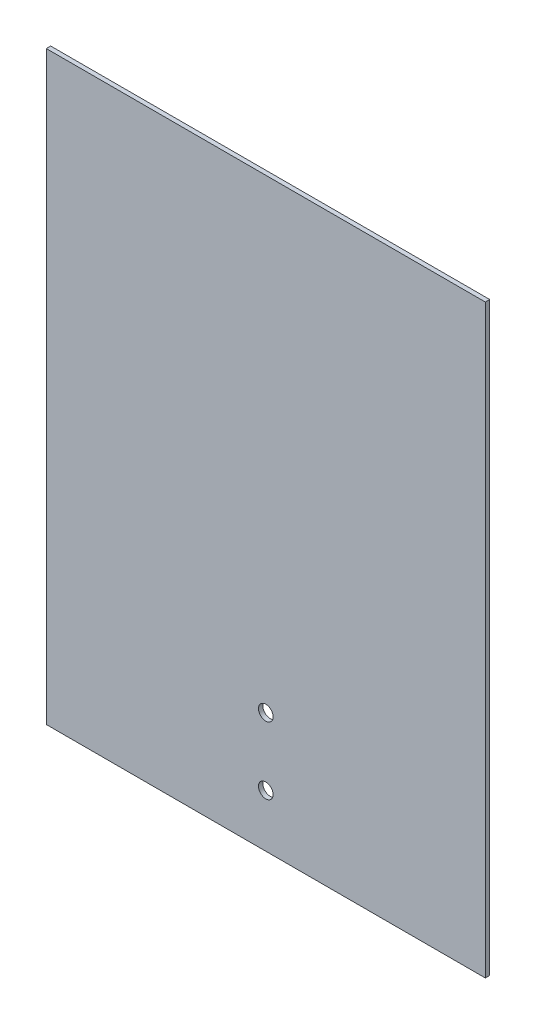
ISO-10303-21;
HEADER;
FILE_DESCRIPTION(('STEP AP214'),'2;1');
FILE_NAME('part.step','',(''),(''),'','','');
FILE_SCHEMA(('AUTOMOTIVE_DESIGN { 1 0 10303 214 1 1 1 1 }'));
ENDSEC;
DATA;
#1=APPLICATION_CONTEXT('core data for automotive mechanical design processes');
#2=APPLICATION_PROTOCOL_DEFINITION('international standard','automotive_design',2000,#1);
#3=PRODUCT_CONTEXT('',#1,'mechanical');
#4=PRODUCT('Part','Part','',(#3));
#5=PRODUCT_RELATED_PRODUCT_CATEGORY('part','',(#4));
#6=PRODUCT_DEFINITION_FORMATION('','',#4);
#7=PRODUCT_DEFINITION_CONTEXT('part definition',#1,'design');
#8=PRODUCT_DEFINITION('design','',#6,#7);
#9=PRODUCT_DEFINITION_SHAPE('','',#8);
#10=(LENGTH_UNIT() NAMED_UNIT(*) SI_UNIT(.MILLI.,.METRE.));
#11=(NAMED_UNIT(*) PLANE_ANGLE_UNIT() SI_UNIT($,.RADIAN.));
#12=(NAMED_UNIT(*) SI_UNIT($,.STERADIAN.) SOLID_ANGLE_UNIT());
#13=UNCERTAINTY_MEASURE_WITH_UNIT(LENGTH_MEASURE(1.E-05),#10,'distance_accuracy_value','');
#14=(GEOMETRIC_REPRESENTATION_CONTEXT(3) GLOBAL_UNCERTAINTY_ASSIGNED_CONTEXT((#13)) GLOBAL_UNIT_ASSIGNED_CONTEXT((#10,
#11,#12)) REPRESENTATION_CONTEXT('',''));
#15=CARTESIAN_POINT('',(0.,0.,0.));
#16=DIRECTION('',(0.,0.,1.));
#17=DIRECTION('',(1.,0.,0.));
#18=AXIS2_PLACEMENT_3D('',#15,#16,#17);
#19=CARTESIAN_POINT('',(75.,-100.,1.5));
#20=DIRECTION('',(-1.,0.,0.));
#21=DIRECTION('',(0.,0.,1.));
#22=AXIS2_PLACEMENT_3D('',#19,#20,#21);
#23=PLANE('',#22);
#24=DIRECTION('',(0.,1.,0.));
#25=VECTOR('',#24,1.);
#26=CARTESIAN_POINT('',(75.,-100.,0.));
#27=LINE('',#26,#25);
#28=CARTESIAN_POINT('',(75.,-100.,0.));
#29=VERTEX_POINT('',#28);
#30=CARTESIAN_POINT('',(75.,100.,0.));
#31=VERTEX_POINT('',#30);
#32=EDGE_CURVE('E106',#29,#31,#27,.T.);
#33=ORIENTED_EDGE('',*,*,#32,.T.);
#34=DIRECTION('',(0.,0.,-1.));
#35=VECTOR('',#34,1.);
#36=CARTESIAN_POINT('',(75.,100.,1.5));
#37=LINE('',#36,#35);
#38=CARTESIAN_POINT('',(75.,100.,1.5));
#39=VERTEX_POINT('',#38);
#40=EDGE_CURVE('E11',#39,#31,#37,.T.);
#41=ORIENTED_EDGE('',*,*,#40,.F.);
#42=DIRECTION('',(0.,1.,0.));
#43=VECTOR('',#42,1.);
#44=CARTESIAN_POINT('',(75.,-100.,1.5));
#45=LINE('',#44,#43);
#46=CARTESIAN_POINT('',(75.,-100.,1.5));
#47=VERTEX_POINT('',#46);
#48=EDGE_CURVE('E90',#47,#39,#45,.T.);
#49=ORIENTED_EDGE('',*,*,#48,.F.);
#50=DIRECTION('',(0.,0.,-1.));
#51=VECTOR('',#50,1.);
#52=CARTESIAN_POINT('',(75.,-100.,1.5));
#53=LINE('',#52,#51);
#54=EDGE_CURVE('E102',#47,#29,#53,.T.);
#55=ORIENTED_EDGE('',*,*,#54,.T.);
#56=EDGE_LOOP('',(#33,#41,#49,#55));
#57=FACE_BOUND('',#56,.T.);
#58=ADVANCED_FACE('F38',(#57),#23,.F.);
#59=CARTESIAN_POINT('',(-75.,100.,1.5));
#60=DIRECTION('',(0.,-1.,0.));
#61=DIRECTION('',(0.,0.,-1.));
#62=AXIS2_PLACEMENT_3D('',#59,#60,#61);
#63=PLANE('',#62);
#64=DIRECTION('',(-1.,0.,0.));
#65=VECTOR('',#64,1.);
#66=CARTESIAN_POINT('',(-75.,100.,0.));
#67=LINE('',#66,#65);
#68=CARTESIAN_POINT('',(-75.,100.,0.));
#69=VERTEX_POINT('',#68);
#70=EDGE_CURVE('E95',#31,#69,#67,.T.);
#71=ORIENTED_EDGE('',*,*,#70,.T.);
#72=DIRECTION('',(0.,0.,-1.));
#73=VECTOR('',#72,1.);
#74=CARTESIAN_POINT('',(-75.,100.,1.5));
#75=LINE('',#74,#73);
#76=CARTESIAN_POINT('',(-75.,100.,1.5));
#77=VERTEX_POINT('',#76);
#78=EDGE_CURVE('E47',#77,#69,#75,.T.);
#79=ORIENTED_EDGE('',*,*,#78,.F.);
#80=DIRECTION('',(-1.,0.,0.));
#81=VECTOR('',#80,1.);
#82=CARTESIAN_POINT('',(-75.,100.,1.5));
#83=LINE('',#82,#81);
#84=EDGE_CURVE('E85',#39,#77,#83,.T.);
#85=ORIENTED_EDGE('',*,*,#84,.F.);
#86=ORIENTED_EDGE('',*,*,#40,.T.);
#87=EDGE_LOOP('',(#71,#79,#85,#86));
#88=FACE_BOUND('',#87,.T.);
#89=ADVANCED_FACE('F94',(#88),#63,.F.);
#90=CARTESIAN_POINT('',(-75.,-100.,1.5));
#91=DIRECTION('',(1.,0.,0.));
#92=DIRECTION('',(0.,0.,-1.));
#93=AXIS2_PLACEMENT_3D('',#90,#91,#92);
#94=PLANE('',#93);
#95=DIRECTION('',(0.,-1.,0.));
#96=VECTOR('',#95,1.);
#97=CARTESIAN_POINT('',(-75.,-100.,0.));
#98=LINE('',#97,#96);
#99=CARTESIAN_POINT('',(-75.,-100.,0.));
#100=VERTEX_POINT('',#99);
#101=EDGE_CURVE('E72',#69,#100,#98,.T.);
#102=ORIENTED_EDGE('',*,*,#101,.T.);
#103=DIRECTION('',(0.,0.,-1.));
#104=VECTOR('',#103,1.);
#105=CARTESIAN_POINT('',(-75.,-100.,1.5));
#106=LINE('',#105,#104);
#107=CARTESIAN_POINT('',(-75.,-100.,1.5));
#108=VERTEX_POINT('',#107);
#109=EDGE_CURVE('E97',#108,#100,#106,.T.);
#110=ORIENTED_EDGE('',*,*,#109,.F.);
#111=DIRECTION('',(0.,-1.,0.));
#112=VECTOR('',#111,1.);
#113=CARTESIAN_POINT('',(-75.,-100.,1.5));
#114=LINE('',#113,#112);
#115=EDGE_CURVE('E88',#77,#108,#114,.T.);
#116=ORIENTED_EDGE('',*,*,#115,.F.);
#117=ORIENTED_EDGE('',*,*,#78,.T.);
#118=EDGE_LOOP('',(#102,#110,#116,#117));
#119=FACE_BOUND('',#118,.T.);
#120=ADVANCED_FACE('F98',(#119),#94,.F.);
#121=CARTESIAN_POINT('',(-75.,-100.,1.5));
#122=DIRECTION('',(0.,1.,0.));
#123=DIRECTION('',(-1.,0.,0.));
#124=AXIS2_PLACEMENT_3D('',#121,#122,#123);
#125=PLANE('',#124);
#126=DIRECTION('',(1.,0.,0.));
#127=VECTOR('',#126,1.);
#128=CARTESIAN_POINT('',(-75.,-100.,0.));
#129=LINE('',#128,#127);
#130=EDGE_CURVE('E78',#100,#29,#129,.T.);
#131=ORIENTED_EDGE('',*,*,#130,.T.);
#132=ORIENTED_EDGE('',*,*,#54,.F.);
#133=DIRECTION('',(1.,0.,0.));
#134=VECTOR('',#133,1.);
#135=CARTESIAN_POINT('',(-75.,-100.,1.5));
#136=LINE('',#135,#134);
#137=EDGE_CURVE('E55',#108,#47,#136,.T.);
#138=ORIENTED_EDGE('',*,*,#137,.F.);
#139=ORIENTED_EDGE('',*,*,#109,.T.);
#140=EDGE_LOOP('',(#131,#132,#138,#139));
#141=FACE_BOUND('',#140,.T.);
#142=ADVANCED_FACE('F120',(#141),#125,.F.);
#143=CARTESIAN_POINT('',(0.,0.,1.5));
#144=DIRECTION('',(0.,0.,-1.));
#145=DIRECTION('',(-1.,0.,0.));
#146=AXIS2_PLACEMENT_3D('',#143,#144,#145);
#147=PLANE('',#146);
#148=CARTESIAN_POINT('',(0.,-59.,1.5));
#149=DIRECTION('',(0.,0.,1.));
#150=DIRECTION('',(1.,0.,0.));
#151=AXIS2_PLACEMENT_3D('',#148,#149,#150);
#152=CIRCLE('',#151,2.5);
#153=CARTESIAN_POINT('',(2.5,-59.,1.5));
#154=VERTEX_POINT('',#153);
#155=EDGE_CURVE('E135',#154,#154,#152,.T.);
#156=ORIENTED_EDGE('',*,*,#155,.F.);
#157=EDGE_LOOP('',(#156));
#158=FACE_BOUND('',#157,.T.);
#159=CARTESIAN_POINT('',(0.,-82.,1.5));
#160=DIRECTION('',(0.,0.,1.));
#161=DIRECTION('',(1.,0.,0.));
#162=AXIS2_PLACEMENT_3D('',#159,#160,#161);
#163=CIRCLE('',#162,2.5);
#164=CARTESIAN_POINT('',(2.5,-82.,1.5));
#165=VERTEX_POINT('',#164);
#166=EDGE_CURVE('E127',#165,#165,#163,.T.);
#167=ORIENTED_EDGE('',*,*,#166,.F.);
#168=EDGE_LOOP('',(#167));
#169=FACE_BOUND('',#168,.T.);
#170=ORIENTED_EDGE('',*,*,#48,.T.);
#171=ORIENTED_EDGE('',*,*,#84,.T.);
#172=ORIENTED_EDGE('',*,*,#115,.T.);
#173=ORIENTED_EDGE('',*,*,#137,.T.);
#174=EDGE_LOOP('',(#170,#171,#172,#173));
#175=FACE_BOUND('',#174,.T.);
#176=ADVANCED_FACE('F86',(#158,#169,#175),#147,.F.);
#177=CARTESIAN_POINT('',(0.,0.,0.));
#178=DIRECTION('',(0.,0.,-1.));
#179=DIRECTION('',(-1.,0.,0.));
#180=AXIS2_PLACEMENT_3D('',#177,#178,#179);
#181=PLANE('',#180);
#182=CARTESIAN_POINT('',(0.,-59.,0.));
#183=DIRECTION('',(0.,0.,1.));
#184=DIRECTION('',(1.,0.,0.));
#185=AXIS2_PLACEMENT_3D('',#182,#183,#184);
#186=CIRCLE('',#185,2.5);
#187=CARTESIAN_POINT('',(2.5,-59.,0.));
#188=VERTEX_POINT('',#187);
#189=EDGE_CURVE('E110',#188,#188,#186,.T.);
#190=ORIENTED_EDGE('',*,*,#189,.T.);
#191=EDGE_LOOP('',(#190));
#192=FACE_BOUND('',#191,.T.);
#193=CARTESIAN_POINT('',(0.,-82.,0.));
#194=DIRECTION('',(0.,0.,1.));
#195=DIRECTION('',(1.,0.,0.));
#196=AXIS2_PLACEMENT_3D('',#193,#194,#195);
#197=CIRCLE('',#196,2.5);
#198=CARTESIAN_POINT('',(2.5,-82.,0.));
#199=VERTEX_POINT('',#198);
#200=EDGE_CURVE('E131',#199,#199,#197,.T.);
#201=ORIENTED_EDGE('',*,*,#200,.T.);
#202=EDGE_LOOP('',(#201));
#203=FACE_BOUND('',#202,.T.);
#204=ORIENTED_EDGE('',*,*,#32,.F.);
#205=ORIENTED_EDGE('',*,*,#130,.F.);
#206=ORIENTED_EDGE('',*,*,#101,.F.);
#207=ORIENTED_EDGE('',*,*,#70,.F.);
#208=EDGE_LOOP('',(#204,#205,#206,#207));
#209=FACE_BOUND('',#208,.T.);
#210=ADVANCED_FACE('F123',(#192,#203,#209),#181,.T.);
#211=CARTESIAN_POINT('',(0.,-82.,0.));
#212=DIRECTION('',(0.,0.,1.));
#213=DIRECTION('',(1.,0.,0.));
#214=AXIS2_PLACEMENT_3D('',#211,#212,#213);
#215=CYLINDRICAL_SURFACE('',#214,2.5);
#216=ORIENTED_EDGE('',*,*,#200,.F.);
#217=EDGE_LOOP('',(#216));
#218=FACE_BOUND('',#217,.T.);
#219=ORIENTED_EDGE('',*,*,#166,.T.);
#220=EDGE_LOOP('',(#219));
#221=FACE_BOUND('',#220,.T.);
#222=ADVANCED_FACE('F148',(#218,#221),#215,.F.);
#223=CARTESIAN_POINT('',(0.,-59.,0.));
#224=DIRECTION('',(0.,0.,1.));
#225=DIRECTION('',(1.,0.,0.));
#226=AXIS2_PLACEMENT_3D('',#223,#224,#225);
#227=CYLINDRICAL_SURFACE('',#226,2.5);
#228=ORIENTED_EDGE('',*,*,#189,.F.);
#229=EDGE_LOOP('',(#228));
#230=FACE_BOUND('',#229,.T.);
#231=ORIENTED_EDGE('',*,*,#155,.T.);
#232=EDGE_LOOP('',(#231));
#233=FACE_BOUND('',#232,.T.);
#234=ADVANCED_FACE('F145',(#230,#233),#227,.F.);
#235=CLOSED_SHELL('',(#58,#89,#120,#142,#176,#210,#222,#234));
#236=MANIFOLD_SOLID_BREP('B2',#235);
#237=ADVANCED_BREP_SHAPE_REPRESENTATION('',(#18,#236),#14);
#238=SHAPE_DEFINITION_REPRESENTATION(#9,#237);
ENDSEC;
END-ISO-10303-21;
